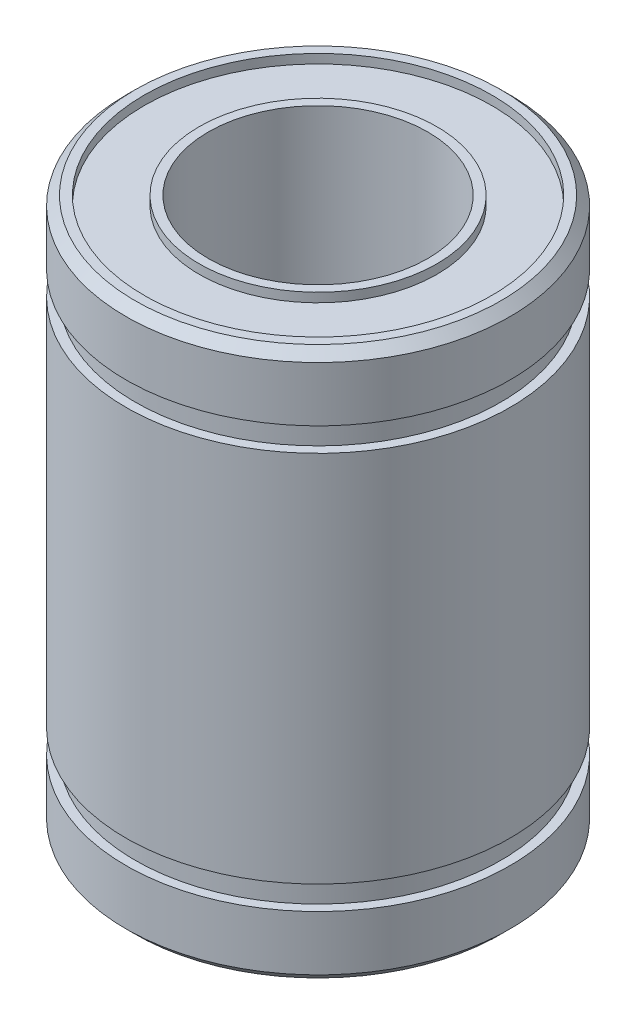
ISO-10303-21;
HEADER;
FILE_DESCRIPTION(('STEP AP214'),'2;1');
FILE_NAME('part.step','',(''),(''),'','','');
FILE_SCHEMA(('AUTOMOTIVE_DESIGN { 1 0 10303 214 1 1 1 1 }'));
ENDSEC;
DATA;
#1=APPLICATION_CONTEXT('core data for automotive mechanical design processes');
#2=APPLICATION_PROTOCOL_DEFINITION('international standard','automotive_design',2000,#1);
#3=PRODUCT_CONTEXT('',#1,'mechanical');
#4=PRODUCT('Part','Part','',(#3));
#5=PRODUCT_RELATED_PRODUCT_CATEGORY('part','',(#4));
#6=PRODUCT_DEFINITION_FORMATION('','',#4);
#7=PRODUCT_DEFINITION_CONTEXT('part definition',#1,'design');
#8=PRODUCT_DEFINITION('design','',#6,#7);
#9=PRODUCT_DEFINITION_SHAPE('','',#8);
#10=(LENGTH_UNIT() NAMED_UNIT(*) SI_UNIT(.MILLI.,.METRE.));
#11=(NAMED_UNIT(*) PLANE_ANGLE_UNIT() SI_UNIT($,.RADIAN.));
#12=(NAMED_UNIT(*) SI_UNIT($,.STERADIAN.) SOLID_ANGLE_UNIT());
#13=UNCERTAINTY_MEASURE_WITH_UNIT(LENGTH_MEASURE(1.E-05),#10,'distance_accuracy_value','');
#14=(GEOMETRIC_REPRESENTATION_CONTEXT(3) GLOBAL_UNCERTAINTY_ASSIGNED_CONTEXT((#13)) GLOBAL_UNIT_ASSIGNED_CONTEXT((#10,
#11,#12)) REPRESENTATION_CONTEXT('',''));
#15=CARTESIAN_POINT('',(0.,0.,0.));
#16=DIRECTION('',(0.,0.,1.));
#17=DIRECTION('',(1.,0.,0.));
#18=AXIS2_PLACEMENT_3D('',#15,#16,#17);
#19=CARTESIAN_POINT('',(-66.9199728296992,-30.,9.33360292470513));
#20=DIRECTION('',(0.,1.,0.));
#21=DIRECTION('',(-1.,0.,0.));
#22=AXIS2_PLACEMENT_3D('',#19,#20,#21);
#23=PLANE('',#22);
#24=CARTESIAN_POINT('',(-76.9199728296992,-30.,9.33360292470513));
#25=DIRECTION('',(0.,1.,0.));
#26=DIRECTION('',(-1.,0.,0.));
#27=AXIS2_PLACEMENT_3D('',#24,#25,#26);
#28=CIRCLE('',#27,6.);
#29=CARTESIAN_POINT('',(-82.9199728296992,-30.,9.33360292470513));
#30=VERTEX_POINT('',#29);
#31=EDGE_CURVE('E58',#30,#30,#28,.T.);
#32=ORIENTED_EDGE('',*,*,#31,.T.);
#33=EDGE_LOOP('',(#32));
#34=FACE_BOUND('',#33,.T.);
#35=CARTESIAN_POINT('',(-76.9199728296992,-30.,9.33360292470513));
#36=DIRECTION('',(0.,1.,0.));
#37=DIRECTION('',(-1.,0.,0.));
#38=AXIS2_PLACEMENT_3D('',#35,#36,#37);
#39=CIRCLE('',#38,6.50000000000002);
#40=CARTESIAN_POINT('',(-83.4199728296992,-30.,9.33360292470513));
#41=VERTEX_POINT('',#40);
#42=EDGE_CURVE('E83',#41,#41,#39,.T.);
#43=ORIENTED_EDGE('',*,*,#42,.F.);
#44=EDGE_LOOP('',(#43));
#45=FACE_BOUND('',#44,.T.);
#46=ADVANCED_FACE('F14',(#34,#45),#23,.F.);
#47=CARTESIAN_POINT('',(-70.9199728296992,0.,9.33360292470513));
#48=DIRECTION('',(0.,-1.,0.));
#49=DIRECTION('',(1.,0.,0.));
#50=AXIS2_PLACEMENT_3D('',#47,#48,#49);
#51=PLANE('',#50);
#52=CARTESIAN_POINT('',(-76.9199728296992,0.,9.33360292470513));
#53=DIRECTION('',(0.,1.,0.));
#54=DIRECTION('',(-1.,0.,0.));
#55=AXIS2_PLACEMENT_3D('',#52,#53,#54);
#56=CIRCLE('',#55,6.00000000000001);
#57=CARTESIAN_POINT('',(-82.9199728296992,0.,9.33360292470513));
#58=VERTEX_POINT('',#57);
#59=EDGE_CURVE('E61',#58,#58,#56,.T.);
#60=ORIENTED_EDGE('',*,*,#59,.F.);
#61=EDGE_LOOP('',(#60));
#62=FACE_BOUND('',#61,.T.);
#63=CARTESIAN_POINT('',(-76.9199728296992,0.,9.33360292470513));
#64=DIRECTION('',(0.,1.,0.));
#65=DIRECTION('',(-1.,0.,0.));
#66=AXIS2_PLACEMENT_3D('',#63,#64,#65);
#67=CIRCLE('',#66,6.50000000000002);
#68=CARTESIAN_POINT('',(-83.4199728296992,0.,9.33360292470513));
#69=VERTEX_POINT('',#68);
#70=EDGE_CURVE('E71',#69,#69,#67,.T.);
#71=ORIENTED_EDGE('',*,*,#70,.T.);
#72=EDGE_LOOP('',(#71));
#73=FACE_BOUND('',#72,.T.);
#74=ADVANCED_FACE('F99',(#62,#73),#51,.F.);
#75=CARTESIAN_POINT('',(-76.9199728296992,0.,9.33360292470513));
#76=DIRECTION('',(0.,1.,0.));
#77=DIRECTION('',(-1.,0.,0.));
#78=AXIS2_PLACEMENT_3D('',#75,#76,#77);
#79=CIRCLE('',#78,9.49999999999999);
#80=CARTESIAN_POINT('',(-86.4199728296992,0.,9.33360292470513));
#81=VERTEX_POINT('',#80);
#82=EDGE_CURVE('E65',#81,#81,#79,.T.);
#83=ORIENTED_EDGE('',*,*,#82,.F.);
#84=EDGE_LOOP('',(#83));
#85=FACE_BOUND('',#84,.T.);
#86=CARTESIAN_POINT('',(-76.9199728296992,0.,9.33360292470513));
#87=DIRECTION('',(0.,1.,0.));
#88=DIRECTION('',(-1.,0.,0.));
#89=AXIS2_PLACEMENT_3D('',#86,#87,#88);
#90=CIRCLE('',#89,10.);
#91=CARTESIAN_POINT('',(-86.9199728296992,0.,9.33360292470513));
#92=VERTEX_POINT('',#91);
#93=EDGE_CURVE('E9',#92,#92,#90,.T.);
#94=ORIENTED_EDGE('',*,*,#93,.T.);
#95=EDGE_LOOP('',(#94));
#96=FACE_BOUND('',#95,.T.);
#97=ADVANCED_FACE('F16',(#85,#96),#51,.F.);
#98=CARTESIAN_POINT('',(-76.9199728296992,-0.499999999999997,9.33360292470513));
#99=DIRECTION('',(0.,-1.,0.));
#100=DIRECTION('',(1.,0.,0.));
#101=AXIS2_PLACEMENT_3D('',#98,#99,#100);
#102=CONICAL_SURFACE('',#101,10.5,0.785398163397453);
#103=ORIENTED_EDGE('',*,*,#93,.F.);
#104=EDGE_LOOP('',(#103));
#105=FACE_BOUND('',#104,.T.);
#106=CARTESIAN_POINT('',(-76.9199728296992,-0.499999999999997,9.33360292470513));
#107=DIRECTION('',(0.,1.,0.));
#108=DIRECTION('',(-1.,0.,0.));
#109=AXIS2_PLACEMENT_3D('',#106,#107,#108);
#110=CIRCLE('',#109,10.5);
#111=CARTESIAN_POINT('',(-87.4199728296992,-0.5,9.33360292470513));
#112=VERTEX_POINT('',#111);
#113=EDGE_CURVE('E21',#112,#112,#110,.T.);
#114=ORIENTED_EDGE('',*,*,#113,.T.);
#115=EDGE_LOOP('',(#114));
#116=FACE_BOUND('',#115,.T.);
#117=ADVANCED_FACE('F153',(#105,#116),#102,.T.);
#118=CARTESIAN_POINT('',(-76.9199728296992,0.,9.33360292470513));
#119=DIRECTION('',(0.,1.,0.));
#120=DIRECTION('',(-1.,0.,0.));
#121=AXIS2_PLACEMENT_3D('',#118,#119,#120);
#122=CYLINDRICAL_SURFACE('',#121,10.5);
#123=ORIENTED_EDGE('',*,*,#113,.F.);
#124=EDGE_LOOP('',(#123));
#125=FACE_BOUND('',#124,.T.);
#126=CARTESIAN_POINT('',(-76.9199728296992,-3.50000000000001,9.33360292470513));
#127=DIRECTION('',(0.,1.,0.));
#128=DIRECTION('',(-1.,0.,0.));
#129=AXIS2_PLACEMENT_3D('',#126,#127,#128);
#130=CIRCLE('',#129,10.5);
#131=CARTESIAN_POINT('',(-87.4199728296992,-3.50000000000001,9.33360292470513));
#132=VERTEX_POINT('',#131);
#133=EDGE_CURVE('E25',#132,#132,#130,.T.);
#134=ORIENTED_EDGE('',*,*,#133,.T.);
#135=EDGE_LOOP('',(#134));
#136=FACE_BOUND('',#135,.T.);
#137=ADVANCED_FACE('F157',(#125,#136),#122,.T.);
#138=CARTESIAN_POINT('',(-66.4199728296992,-3.50000000000001,9.33360292470513));
#139=DIRECTION('',(0.,1.,0.));
#140=DIRECTION('',(-1.,0.,0.));
#141=AXIS2_PLACEMENT_3D('',#138,#139,#140);
#142=PLANE('',#141);
#143=ORIENTED_EDGE('',*,*,#133,.F.);
#144=EDGE_LOOP('',(#143));
#145=FACE_BOUND('',#144,.T.);
#146=CARTESIAN_POINT('',(-76.9199728296992,-3.50000000000001,9.33360292470513));
#147=DIRECTION('',(0.,1.,0.));
#148=DIRECTION('',(-1.,0.,0.));
#149=AXIS2_PLACEMENT_3D('',#146,#147,#148);
#150=CIRCLE('',#149,10.);
#151=CARTESIAN_POINT('',(-86.9199728296992,-3.50000000000001,9.33360292470513));
#152=VERTEX_POINT('',#151);
#153=EDGE_CURVE('E29',#152,#152,#150,.T.);
#154=ORIENTED_EDGE('',*,*,#153,.T.);
#155=EDGE_LOOP('',(#154));
#156=FACE_BOUND('',#155,.T.);
#157=ADVANCED_FACE('F162',(#145,#156),#142,.F.);
#158=CARTESIAN_POINT('',(-76.9199728296992,0.,9.33360292470513));
#159=DIRECTION('',(0.,1.,0.));
#160=DIRECTION('',(-1.,0.,0.));
#161=AXIS2_PLACEMENT_3D('',#158,#159,#160);
#162=CYLINDRICAL_SURFACE('',#161,10.);
#163=ORIENTED_EDGE('',*,*,#153,.F.);
#164=EDGE_LOOP('',(#163));
#165=FACE_BOUND('',#164,.T.);
#166=CARTESIAN_POINT('',(-76.9199728296992,-4.80000000000001,9.33360292470513));
#167=DIRECTION('',(0.,1.,0.));
#168=DIRECTION('',(-1.,0.,0.));
#169=AXIS2_PLACEMENT_3D('',#166,#167,#168);
#170=CIRCLE('',#169,10.);
#171=CARTESIAN_POINT('',(-86.9199728296992,-4.80000000000001,9.33360292470513));
#172=VERTEX_POINT('',#171);
#173=EDGE_CURVE('E34',#172,#172,#170,.T.);
#174=ORIENTED_EDGE('',*,*,#173,.T.);
#175=EDGE_LOOP('',(#174));
#176=FACE_BOUND('',#175,.T.);
#177=ADVANCED_FACE('F168',(#165,#176),#162,.T.);
#178=CARTESIAN_POINT('',(-66.9199728296992,-4.80000000000001,9.33360292470513));
#179=DIRECTION('',(0.,-1.,0.));
#180=DIRECTION('',(1.,0.,0.));
#181=AXIS2_PLACEMENT_3D('',#178,#179,#180);
#182=PLANE('',#181);
#183=ORIENTED_EDGE('',*,*,#173,.F.);
#184=EDGE_LOOP('',(#183));
#185=FACE_BOUND('',#184,.T.);
#186=CARTESIAN_POINT('',(-76.9199728296992,-4.80000000000001,9.33360292470513));
#187=DIRECTION('',(0.,1.,0.));
#188=DIRECTION('',(-1.,0.,0.));
#189=AXIS2_PLACEMENT_3D('',#186,#187,#188);
#190=CIRCLE('',#189,10.5);
#191=CARTESIAN_POINT('',(-87.4199728296992,-4.80000000000001,9.33360292470513));
#192=VERTEX_POINT('',#191);
#193=EDGE_CURVE('E37',#192,#192,#190,.T.);
#194=ORIENTED_EDGE('',*,*,#193,.T.);
#195=EDGE_LOOP('',(#194));
#196=FACE_BOUND('',#195,.T.);
#197=ADVANCED_FACE('F172',(#185,#196),#182,.F.);
#198=CARTESIAN_POINT('',(-76.9199728296992,0.,9.33360292470513));
#199=DIRECTION('',(0.,1.,0.));
#200=DIRECTION('',(-1.,0.,0.));
#201=AXIS2_PLACEMENT_3D('',#198,#199,#200);
#202=CYLINDRICAL_SURFACE('',#201,10.5);
#203=ORIENTED_EDGE('',*,*,#193,.F.);
#204=EDGE_LOOP('',(#203));
#205=FACE_BOUND('',#204,.T.);
#206=CARTESIAN_POINT('',(-76.9199728296992,-25.2,9.33360292470513));
#207=DIRECTION('',(0.,1.,0.));
#208=DIRECTION('',(-1.,0.,0.));
#209=AXIS2_PLACEMENT_3D('',#206,#207,#208);
#210=CIRCLE('',#209,10.5);
#211=CARTESIAN_POINT('',(-87.4199728296992,-25.2,9.33360292470513));
#212=VERTEX_POINT('',#211);
#213=EDGE_CURVE('E40',#212,#212,#210,.T.);
#214=ORIENTED_EDGE('',*,*,#213,.T.);
#215=EDGE_LOOP('',(#214));
#216=FACE_BOUND('',#215,.T.);
#217=ADVANCED_FACE('F176',(#205,#216),#202,.T.);
#218=CARTESIAN_POINT('',(-66.4199728296992,-25.2,9.33360292470513));
#219=DIRECTION('',(0.,1.,0.));
#220=DIRECTION('',(-1.,0.,0.));
#221=AXIS2_PLACEMENT_3D('',#218,#219,#220);
#222=PLANE('',#221);
#223=ORIENTED_EDGE('',*,*,#213,.F.);
#224=EDGE_LOOP('',(#223));
#225=FACE_BOUND('',#224,.T.);
#226=CARTESIAN_POINT('',(-76.9199728296992,-25.2,9.33360292470513));
#227=DIRECTION('',(0.,1.,0.));
#228=DIRECTION('',(-1.,0.,0.));
#229=AXIS2_PLACEMENT_3D('',#226,#227,#228);
#230=CIRCLE('',#229,10.);
#231=CARTESIAN_POINT('',(-86.9199728296992,-25.2,9.33360292470513));
#232=VERTEX_POINT('',#231);
#233=EDGE_CURVE('E43',#232,#232,#230,.T.);
#234=ORIENTED_EDGE('',*,*,#233,.T.);
#235=EDGE_LOOP('',(#234));
#236=FACE_BOUND('',#235,.T.);
#237=ADVANCED_FACE('F180',(#225,#236),#222,.F.);
#238=CARTESIAN_POINT('',(-76.9199728296992,0.,9.33360292470513));
#239=DIRECTION('',(0.,1.,0.));
#240=DIRECTION('',(-1.,0.,0.));
#241=AXIS2_PLACEMENT_3D('',#238,#239,#240);
#242=CYLINDRICAL_SURFACE('',#241,10.);
#243=ORIENTED_EDGE('',*,*,#233,.F.);
#244=EDGE_LOOP('',(#243));
#245=FACE_BOUND('',#244,.T.);
#246=CARTESIAN_POINT('',(-76.9199728296992,-26.5,9.33360292470513));
#247=DIRECTION('',(0.,1.,0.));
#248=DIRECTION('',(-1.,0.,0.));
#249=AXIS2_PLACEMENT_3D('',#246,#247,#248);
#250=CIRCLE('',#249,10.);
#251=CARTESIAN_POINT('',(-86.9199728296992,-26.5,9.33360292470513));
#252=VERTEX_POINT('',#251);
#253=EDGE_CURVE('E46',#252,#252,#250,.T.);
#254=ORIENTED_EDGE('',*,*,#253,.T.);
#255=EDGE_LOOP('',(#254));
#256=FACE_BOUND('',#255,.T.);
#257=ADVANCED_FACE('F184',(#245,#256),#242,.T.);
#258=CARTESIAN_POINT('',(-66.9199728296992,-26.5,9.33360292470513));
#259=DIRECTION('',(0.,-1.,0.));
#260=DIRECTION('',(1.,0.,0.));
#261=AXIS2_PLACEMENT_3D('',#258,#259,#260);
#262=PLANE('',#261);
#263=ORIENTED_EDGE('',*,*,#253,.F.);
#264=EDGE_LOOP('',(#263));
#265=FACE_BOUND('',#264,.T.);
#266=CARTESIAN_POINT('',(-76.9199728296992,-26.5,9.33360292470513));
#267=DIRECTION('',(0.,1.,0.));
#268=DIRECTION('',(-1.,0.,0.));
#269=AXIS2_PLACEMENT_3D('',#266,#267,#268);
#270=CIRCLE('',#269,10.5);
#271=CARTESIAN_POINT('',(-87.4199728296992,-26.5,9.33360292470513));
#272=VERTEX_POINT('',#271);
#273=EDGE_CURVE('E49',#272,#272,#270,.T.);
#274=ORIENTED_EDGE('',*,*,#273,.T.);
#275=EDGE_LOOP('',(#274));
#276=FACE_BOUND('',#275,.T.);
#277=ADVANCED_FACE('F188',(#265,#276),#262,.F.);
#278=CARTESIAN_POINT('',(-76.9199728296992,0.,9.33360292470513));
#279=DIRECTION('',(0.,1.,0.));
#280=DIRECTION('',(-1.,0.,0.));
#281=AXIS2_PLACEMENT_3D('',#278,#279,#280);
#282=CYLINDRICAL_SURFACE('',#281,10.5);
#283=ORIENTED_EDGE('',*,*,#273,.F.);
#284=EDGE_LOOP('',(#283));
#285=FACE_BOUND('',#284,.T.);
#286=CARTESIAN_POINT('',(-76.9199728296992,-29.5,9.33360292470513));
#287=DIRECTION('',(0.,1.,0.));
#288=DIRECTION('',(-1.,0.,0.));
#289=AXIS2_PLACEMENT_3D('',#286,#287,#288);
#290=CIRCLE('',#289,10.5);
#291=CARTESIAN_POINT('',(-87.4199728296992,-29.5,9.33360292470513));
#292=VERTEX_POINT('',#291);
#293=EDGE_CURVE('E52',#292,#292,#290,.T.);
#294=ORIENTED_EDGE('',*,*,#293,.T.);
#295=EDGE_LOOP('',(#294));
#296=FACE_BOUND('',#295,.T.);
#297=ADVANCED_FACE('F120',(#285,#296),#282,.T.);
#298=CARTESIAN_POINT('',(-76.9199728296992,-30.,9.33360292470513));
#299=DIRECTION('',(0.,1.,0.));
#300=DIRECTION('',(-1.,0.,0.));
#301=AXIS2_PLACEMENT_3D('',#298,#299,#300);
#302=CONICAL_SURFACE('',#301,10.,0.785398163397455);
#303=ORIENTED_EDGE('',*,*,#293,.F.);
#304=EDGE_LOOP('',(#303));
#305=FACE_BOUND('',#304,.T.);
#306=CARTESIAN_POINT('',(-76.9199728296992,-30.,9.33360292470513));
#307=DIRECTION('',(0.,1.,0.));
#308=DIRECTION('',(-1.,0.,0.));
#309=AXIS2_PLACEMENT_3D('',#306,#307,#308);
#310=CIRCLE('',#309,9.99999999999999);
#311=CARTESIAN_POINT('',(-86.9199728296992,-30.,9.33360292470513));
#312=VERTEX_POINT('',#311);
#313=EDGE_CURVE('E55',#312,#312,#310,.T.);
#314=ORIENTED_EDGE('',*,*,#313,.T.);
#315=EDGE_LOOP('',(#314));
#316=FACE_BOUND('',#315,.T.);
#317=ADVANCED_FACE('F112',(#305,#316),#302,.T.);
#318=CARTESIAN_POINT('',(-76.9199728296992,-30.,9.33360292470513));
#319=DIRECTION('',(0.,1.,0.));
#320=DIRECTION('',(-1.,0.,0.));
#321=AXIS2_PLACEMENT_3D('',#318,#319,#320);
#322=CIRCLE('',#321,9.49999999999999);
#323=CARTESIAN_POINT('',(-86.4199728296992,-30.,9.33360292470513));
#324=VERTEX_POINT('',#323);
#325=EDGE_CURVE('E77',#324,#324,#322,.T.);
#326=ORIENTED_EDGE('',*,*,#325,.T.);
#327=EDGE_LOOP('',(#326));
#328=FACE_BOUND('',#327,.T.);
#329=ORIENTED_EDGE('',*,*,#313,.F.);
#330=EDGE_LOOP('',(#329));
#331=FACE_BOUND('',#330,.T.);
#332=ADVANCED_FACE('F102',(#328,#331),#23,.F.);
#333=CARTESIAN_POINT('',(-76.9199728296992,0.,9.33360292470513));
#334=DIRECTION('',(0.,1.,0.));
#335=DIRECTION('',(-1.,0.,0.));
#336=AXIS2_PLACEMENT_3D('',#333,#334,#335);
#337=CYLINDRICAL_SURFACE('',#336,6.);
#338=ORIENTED_EDGE('',*,*,#31,.F.);
#339=EDGE_LOOP('',(#338));
#340=FACE_BOUND('',#339,.T.);
#341=ORIENTED_EDGE('',*,*,#59,.T.);
#342=EDGE_LOOP('',(#341));
#343=FACE_BOUND('',#342,.T.);
#344=ADVANCED_FACE('F111',(#340,#343),#337,.F.);
#345=CARTESIAN_POINT('',(-76.9199728296992,-0.500000000000007,9.33360292470513));
#346=DIRECTION('',(0.,1.,0.));
#347=DIRECTION('',(-1.,0.,0.));
#348=AXIS2_PLACEMENT_3D('',#345,#346,#347);
#349=CYLINDRICAL_SURFACE('',#348,9.49999999999999);
#350=CARTESIAN_POINT('',(-76.9199728296992,-0.500000000000007,9.33360292470513));
#351=DIRECTION('',(0.,1.,0.));
#352=DIRECTION('',(-1.,0.,0.));
#353=AXIS2_PLACEMENT_3D('',#350,#351,#352);
#354=CIRCLE('',#353,9.49999999999999);
#355=CARTESIAN_POINT('',(-86.4199728296992,-0.500000000000008,9.33360292470513));
#356=VERTEX_POINT('',#355);
#357=EDGE_CURVE('E64',#356,#356,#354,.T.);
#358=ORIENTED_EDGE('',*,*,#357,.F.);
#359=EDGE_LOOP('',(#358));
#360=FACE_BOUND('',#359,.T.);
#361=ORIENTED_EDGE('',*,*,#82,.T.);
#362=EDGE_LOOP('',(#361));
#363=FACE_BOUND('',#362,.T.);
#364=ADVANCED_FACE('F118',(#360,#363),#349,.F.);
#365=CARTESIAN_POINT('',(-76.9199728296992,-0.500000000000007,9.33360292470513));
#366=DIRECTION('',(0.,1.,0.));
#367=DIRECTION('',(-1.,0.,0.));
#368=AXIS2_PLACEMENT_3D('',#365,#366,#367);
#369=PLANE('',#368);
#370=CARTESIAN_POINT('',(-76.9199728296992,-0.500000000000007,9.33360292470513));
#371=DIRECTION('',(0.,1.,0.));
#372=DIRECTION('',(-1.,0.,0.));
#373=AXIS2_PLACEMENT_3D('',#370,#371,#372);
#374=CIRCLE('',#373,6.50000000000002);
#375=CARTESIAN_POINT('',(-83.4199728296992,-0.500000000000008,9.33360292470513));
#376=VERTEX_POINT('',#375);
#377=EDGE_CURVE('E68',#376,#376,#374,.T.);
#378=ORIENTED_EDGE('',*,*,#377,.F.);
#379=EDGE_LOOP('',(#378));
#380=FACE_BOUND('',#379,.T.);
#381=ORIENTED_EDGE('',*,*,#357,.T.);
#382=EDGE_LOOP('',(#381));
#383=FACE_BOUND('',#382,.T.);
#384=ADVANCED_FACE('F139',(#380,#383),#369,.T.);
#385=CARTESIAN_POINT('',(-76.9199728296992,-0.500000000000007,9.33360292470513));
#386=DIRECTION('',(0.,1.,0.));
#387=DIRECTION('',(-1.,0.,0.));
#388=AXIS2_PLACEMENT_3D('',#385,#386,#387);
#389=CYLINDRICAL_SURFACE('',#388,6.50000000000002);
#390=ORIENTED_EDGE('',*,*,#377,.T.);
#391=EDGE_LOOP('',(#390));
#392=FACE_BOUND('',#391,.T.);
#393=ORIENTED_EDGE('',*,*,#70,.F.);
#394=EDGE_LOOP('',(#393));
#395=FACE_BOUND('',#394,.T.);
#396=ADVANCED_FACE('F133',(#392,#395),#389,.T.);
#397=CARTESIAN_POINT('',(-76.9199728296992,-29.5,9.33360292470513));
#398=DIRECTION('',(0.,-1.,0.));
#399=DIRECTION('',(-1.,0.,0.));
#400=AXIS2_PLACEMENT_3D('',#397,#398,#399);
#401=PLANE('',#400);
#402=CARTESIAN_POINT('',(-76.9199728296992,-29.5,9.33360292470513));
#403=DIRECTION('',(0.,1.,0.));
#404=DIRECTION('',(-1.,0.,0.));
#405=AXIS2_PLACEMENT_3D('',#402,#403,#404);
#406=CIRCLE('',#405,9.49999999999999);
#407=CARTESIAN_POINT('',(-86.4199728296992,-29.5,9.33360292470513));
#408=VERTEX_POINT('',#407);
#409=EDGE_CURVE('E74',#408,#408,#406,.T.);
#410=ORIENTED_EDGE('',*,*,#409,.F.);
#411=EDGE_LOOP('',(#410));
#412=FACE_BOUND('',#411,.T.);
#413=CARTESIAN_POINT('',(-76.9199728296992,-29.5,9.33360292470513));
#414=DIRECTION('',(0.,1.,0.));
#415=DIRECTION('',(-1.,0.,0.));
#416=AXIS2_PLACEMENT_3D('',#413,#414,#415);
#417=CIRCLE('',#416,6.50000000000002);
#418=CARTESIAN_POINT('',(-83.4199728296992,-29.5,9.33360292470513));
#419=VERTEX_POINT('',#418);
#420=EDGE_CURVE('E80',#419,#419,#417,.T.);
#421=ORIENTED_EDGE('',*,*,#420,.T.);
#422=EDGE_LOOP('',(#421));
#423=FACE_BOUND('',#422,.T.);
#424=ADVANCED_FACE('F89',(#412,#423),#401,.T.);
#425=CARTESIAN_POINT('',(-76.9199728296992,-29.5,9.33360292470513));
#426=DIRECTION('',(0.,-1.,0.));
#427=DIRECTION('',(1.,0.,0.));
#428=AXIS2_PLACEMENT_3D('',#425,#426,#427);
#429=CYLINDRICAL_SURFACE('',#428,9.49999999999999);
#430=ORIENTED_EDGE('',*,*,#409,.T.);
#431=EDGE_LOOP('',(#430));
#432=FACE_BOUND('',#431,.T.);
#433=ORIENTED_EDGE('',*,*,#325,.F.);
#434=EDGE_LOOP('',(#433));
#435=FACE_BOUND('',#434,.T.);
#436=ADVANCED_FACE('F94',(#432,#435),#429,.F.);
#437=CARTESIAN_POINT('',(-76.9199728296992,-29.5,9.33360292470513));
#438=DIRECTION('',(0.,-1.,0.));
#439=DIRECTION('',(1.,0.,0.));
#440=AXIS2_PLACEMENT_3D('',#437,#438,#439);
#441=CYLINDRICAL_SURFACE('',#440,6.50000000000002);
#442=ORIENTED_EDGE('',*,*,#420,.F.);
#443=EDGE_LOOP('',(#442));
#444=FACE_BOUND('',#443,.T.);
#445=ORIENTED_EDGE('',*,*,#42,.T.);
#446=EDGE_LOOP('',(#445));
#447=FACE_BOUND('',#446,.T.);
#448=ADVANCED_FACE('F91',(#444,#447),#441,.T.);
#449=CLOSED_SHELL('',(#46,#74,#97,#117,#137,#157,#177,#197,#217,#237,#257,#277,#297,#317,#332,
#344,#364,#384,#396,#424,#436,#448));
#450=MANIFOLD_SOLID_BREP('B1',#449);
#451=ADVANCED_BREP_SHAPE_REPRESENTATION('',(#18,#450),#14);
#452=SHAPE_DEFINITION_REPRESENTATION(#9,#451);
ENDSEC;
END-ISO-10303-21;
